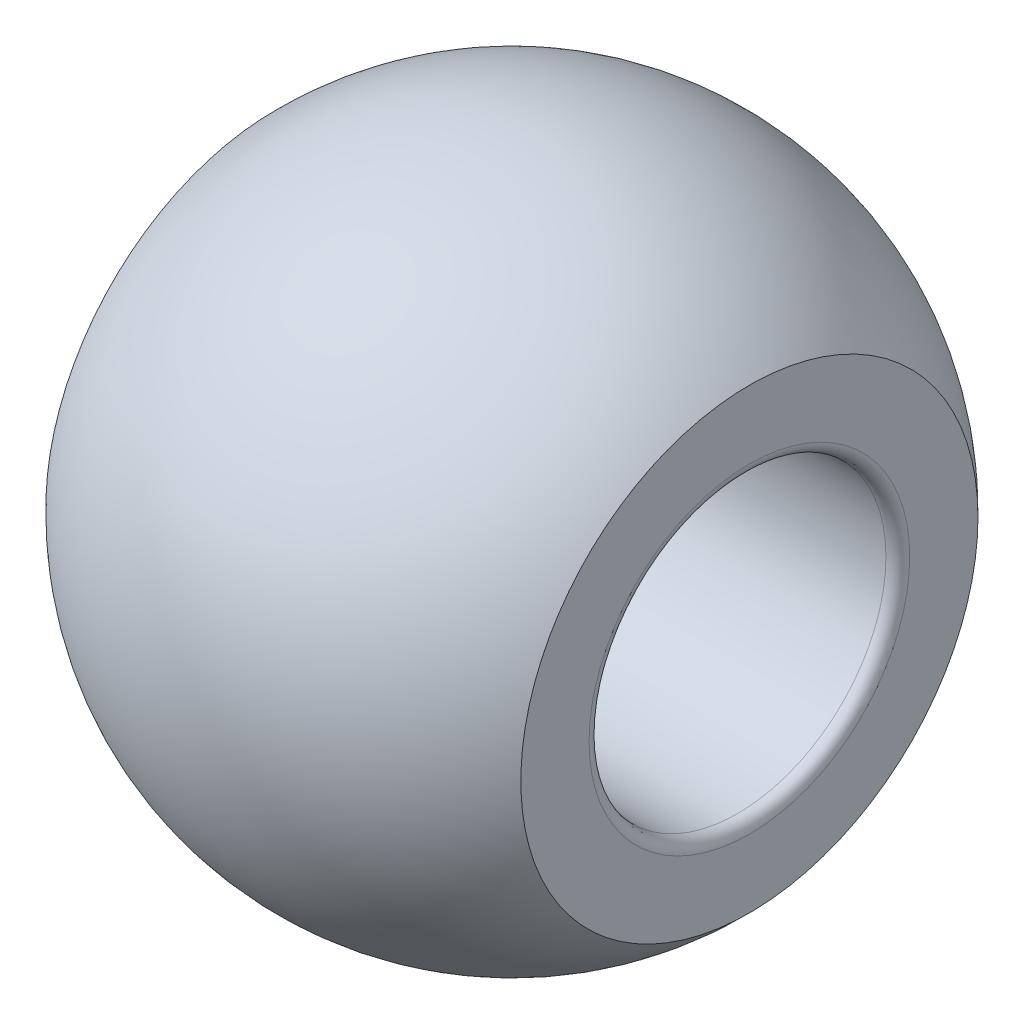
ISO-10303-21;
HEADER;
FILE_DESCRIPTION(('STEP AP214'),'2;1');
FILE_NAME('part.step','',(''),(''),'','','');
FILE_SCHEMA(('AUTOMOTIVE_DESIGN { 1 0 10303 214 1 1 1 1 }'));
ENDSEC;
DATA;
#1=APPLICATION_CONTEXT('core data for automotive mechanical design processes');
#2=APPLICATION_PROTOCOL_DEFINITION('international standard','automotive_design',2000,#1);
#3=PRODUCT_CONTEXT('',#1,'mechanical');
#4=PRODUCT('Part','Part','',(#3));
#5=PRODUCT_RELATED_PRODUCT_CATEGORY('part','',(#4));
#6=PRODUCT_DEFINITION_FORMATION('','',#4);
#7=PRODUCT_DEFINITION_CONTEXT('part definition',#1,'design');
#8=PRODUCT_DEFINITION('design','',#6,#7);
#9=PRODUCT_DEFINITION_SHAPE('','',#8);
#10=(LENGTH_UNIT() NAMED_UNIT(*) SI_UNIT(.MILLI.,.METRE.));
#11=(NAMED_UNIT(*) PLANE_ANGLE_UNIT() SI_UNIT($,.RADIAN.));
#12=(NAMED_UNIT(*) SI_UNIT($,.STERADIAN.) SOLID_ANGLE_UNIT());
#13=UNCERTAINTY_MEASURE_WITH_UNIT(LENGTH_MEASURE(1.E-05),#10,'distance_accuracy_value','');
#14=(GEOMETRIC_REPRESENTATION_CONTEXT(3) GLOBAL_UNCERTAINTY_ASSIGNED_CONTEXT((#13)) GLOBAL_UNIT_ASSIGNED_CONTEXT((#10,
#11,#12)) REPRESENTATION_CONTEXT('',''));
#15=CARTESIAN_POINT('',(0.,0.,0.));
#16=DIRECTION('',(0.,0.,1.));
#17=DIRECTION('',(1.,0.,0.));
#18=AXIS2_PLACEMENT_3D('',#15,#16,#17);
#19=CARTESIAN_POINT('',(0.,3.85,0.));
#20=DIRECTION('',(-1.,0.,0.));
#21=DIRECTION('',(0.,0.,1.));
#22=AXIS2_PLACEMENT_3D('',#19,#20,#21);
#23=PLANE('',#22);
#24=CARTESIAN_POINT('',(0.,0.,0.));
#25=DIRECTION('',(1.,0.,0.));
#26=DIRECTION('',(0.,0.,-1.));
#27=AXIS2_PLACEMENT_3D('',#24,#25,#26);
#28=CIRCLE('',#27,2.7);
#29=CARTESIAN_POINT('',(0.,0.,-2.7));
#30=VERTEX_POINT('',#29);
#31=EDGE_CURVE('E44',#30,#30,#28,.T.);
#32=ORIENTED_EDGE('',*,*,#31,.T.);
#33=EDGE_LOOP('',(#32));
#34=FACE_BOUND('',#33,.T.);
#35=CARTESIAN_POINT('',(0.,0.,0.));
#36=DIRECTION('',(1.,0.,0.));
#37=DIRECTION('',(0.,0.,-1.));
#38=AXIS2_PLACEMENT_3D('',#35,#36,#37);
#39=CIRCLE('',#38,3.85);
#40=CARTESIAN_POINT('',(0.,0.,-3.85));
#41=VERTEX_POINT('',#40);
#42=EDGE_CURVE('E40',#41,#41,#39,.T.);
#43=ORIENTED_EDGE('',*,*,#42,.F.);
#44=EDGE_LOOP('',(#43));
#45=FACE_BOUND('',#44,.T.);
#46=ADVANCED_FACE('F15',(#34,#45),#23,.T.);
#47=CARTESIAN_POINT('',(0.200000000000015,0.,0.));
#48=DIRECTION('',(1.,0.,0.));
#49=DIRECTION('',(0.,0.,-1.));
#50=AXIS2_PLACEMENT_3D('',#47,#48,#49);
#51=TOROIDAL_SURFACE('',#50,2.7,0.200000000000015);
#52=CARTESIAN_POINT('',(0.2,0.,0.));
#53=DIRECTION('',(1.,0.,0.));
#54=DIRECTION('',(0.,0.,-1.));
#55=AXIS2_PLACEMENT_3D('',#52,#53,#54);
#56=CIRCLE('',#55,2.5);
#57=CARTESIAN_POINT('',(0.2,0.,-2.5));
#58=VERTEX_POINT('',#57);
#59=EDGE_CURVE('E34',#58,#58,#56,.T.);
#60=ORIENTED_EDGE('',*,*,#59,.T.);
#61=EDGE_LOOP('',(#60));
#62=FACE_BOUND('',#61,.T.);
#63=ORIENTED_EDGE('',*,*,#31,.F.);
#64=EDGE_LOOP('',(#63));
#65=FACE_BOUND('',#64,.T.);
#66=ADVANCED_FACE('F51',(#62,#65),#51,.T.);
#67=CARTESIAN_POINT('',(4.,0.,0.));
#68=DIRECTION('',(1.,0.,0.));
#69=DIRECTION('',(0.,0.,-1.));
#70=AXIS2_PLACEMENT_3D('',#67,#68,#69);
#71=DEGENERATE_TOROIDAL_SURFACE('',#70,0.00461087530258773,5.55500000000009,.F.);
#72=ORIENTED_EDGE('',*,*,#42,.T.);
#73=EDGE_LOOP('',(#72));
#74=FACE_BOUND('',#73,.T.);
#75=CARTESIAN_POINT('',(8.,0.,0.));
#76=DIRECTION('',(1.,0.,0.));
#77=DIRECTION('',(0.,0.,-1.));
#78=AXIS2_PLACEMENT_3D('',#75,#76,#77);
#79=CIRCLE('',#78,3.85);
#80=CARTESIAN_POINT('',(8.,0.,-3.85));
#81=VERTEX_POINT('',#80);
#82=EDGE_CURVE('E29',#81,#81,#79,.T.);
#83=ORIENTED_EDGE('',*,*,#82,.F.);
#84=EDGE_LOOP('',(#83));
#85=FACE_BOUND('',#84,.T.);
#86=ADVANCED_FACE('F53',(#74,#85),#71,.F.);
#87=CARTESIAN_POINT('',(8.,0.,0.));
#88=DIRECTION('',(1.,0.,0.));
#89=DIRECTION('',(0.,0.,-1.));
#90=AXIS2_PLACEMENT_3D('',#87,#88,#89);
#91=CYLINDRICAL_SURFACE('',#90,2.5);
#92=CARTESIAN_POINT('',(7.8,0.,0.));
#93=DIRECTION('',(1.,0.,0.));
#94=DIRECTION('',(0.,0.,-1.));
#95=AXIS2_PLACEMENT_3D('',#92,#93,#94);
#96=CIRCLE('',#95,2.5);
#97=CARTESIAN_POINT('',(7.8,0.,-2.5));
#98=VERTEX_POINT('',#97);
#99=EDGE_CURVE('E23',#98,#98,#96,.T.);
#100=ORIENTED_EDGE('',*,*,#99,.T.);
#101=EDGE_LOOP('',(#100));
#102=FACE_BOUND('',#101,.T.);
#103=ORIENTED_EDGE('',*,*,#59,.F.);
#104=EDGE_LOOP('',(#103));
#105=FACE_BOUND('',#104,.T.);
#106=ADVANCED_FACE('F61',(#102,#105),#91,.F.);
#107=CARTESIAN_POINT('',(8.,2.7,0.));
#108=DIRECTION('',(1.,0.,0.));
#109=DIRECTION('',(0.,0.,-1.));
#110=AXIS2_PLACEMENT_3D('',#107,#108,#109);
#111=PLANE('',#110);
#112=ORIENTED_EDGE('',*,*,#82,.T.);
#113=EDGE_LOOP('',(#112));
#114=FACE_BOUND('',#113,.T.);
#115=CARTESIAN_POINT('',(8.,0.,0.));
#116=DIRECTION('',(1.,0.,0.));
#117=DIRECTION('',(0.,0.,-1.));
#118=AXIS2_PLACEMENT_3D('',#115,#116,#117);
#119=CIRCLE('',#118,2.6999998880527);
#120=CARTESIAN_POINT('',(8.,0.,-2.6999998880527));
#121=VERTEX_POINT('',#120);
#122=EDGE_CURVE('E10',#121,#121,#119,.T.);
#123=ORIENTED_EDGE('',*,*,#122,.F.);
#124=EDGE_LOOP('',(#123));
#125=FACE_BOUND('',#124,.T.);
#126=ADVANCED_FACE('F67',(#114,#125),#111,.T.);
#127=CARTESIAN_POINT('',(7.8,0.,0.));
#128=DIRECTION('',(1.,0.,0.));
#129=DIRECTION('',(0.,0.,-1.));
#130=AXIS2_PLACEMENT_3D('',#127,#128,#129);
#131=TOROIDAL_SURFACE('',#130,2.7,0.200000000000032);
#132=ORIENTED_EDGE('',*,*,#122,.T.);
#133=EDGE_LOOP('',(#132));
#134=FACE_BOUND('',#133,.T.);
#135=ORIENTED_EDGE('',*,*,#99,.F.);
#136=EDGE_LOOP('',(#135));
#137=FACE_BOUND('',#136,.T.);
#138=ADVANCED_FACE('F17',(#134,#137),#131,.T.);
#139=CLOSED_SHELL('',(#46,#66,#86,#106,#126,#138));
#140=MANIFOLD_SOLID_BREP('B1',#139);
#141=ADVANCED_BREP_SHAPE_REPRESENTATION('',(#18,#140),#14);
#142=SHAPE_DEFINITION_REPRESENTATION(#9,#141);
ENDSEC;
END-ISO-10303-21;
